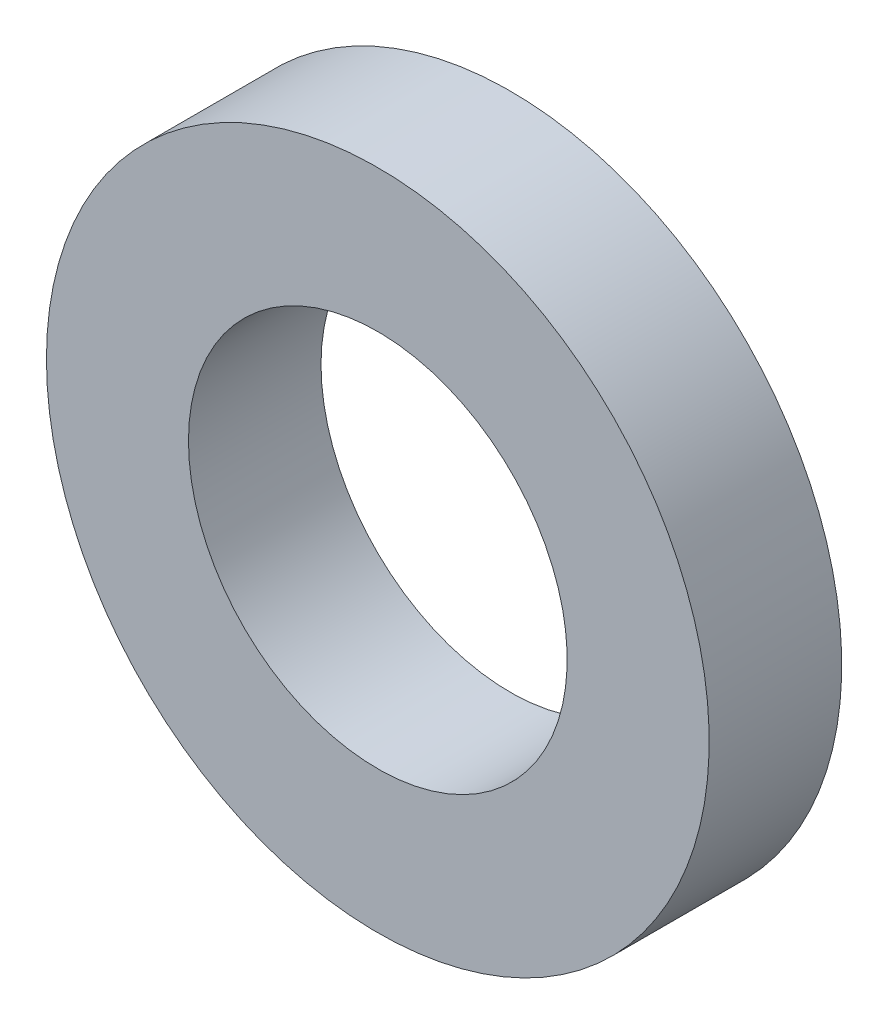
ISO-10303-21;
HEADER;
FILE_DESCRIPTION(('STEP AP214'),'2;1');
FILE_NAME('part.step','',(''),(''),'','','');
FILE_SCHEMA(('AUTOMOTIVE_DESIGN { 1 0 10303 214 1 1 1 1 }'));
ENDSEC;
DATA;
#1=APPLICATION_CONTEXT('core data for automotive mechanical design processes');
#2=APPLICATION_PROTOCOL_DEFINITION('international standard','automotive_design',2000,#1);
#3=PRODUCT_CONTEXT('',#1,'mechanical');
#4=PRODUCT('Part','Part','',(#3));
#5=PRODUCT_RELATED_PRODUCT_CATEGORY('part','',(#4));
#6=PRODUCT_DEFINITION_FORMATION('','',#4);
#7=PRODUCT_DEFINITION_CONTEXT('part definition',#1,'design');
#8=PRODUCT_DEFINITION('design','',#6,#7);
#9=PRODUCT_DEFINITION_SHAPE('','',#8);
#10=(LENGTH_UNIT() NAMED_UNIT(*) SI_UNIT(.MILLI.,.METRE.));
#11=(NAMED_UNIT(*) PLANE_ANGLE_UNIT() SI_UNIT($,.RADIAN.));
#12=(NAMED_UNIT(*) SI_UNIT($,.STERADIAN.) SOLID_ANGLE_UNIT());
#13=UNCERTAINTY_MEASURE_WITH_UNIT(LENGTH_MEASURE(1.E-05),#10,'distance_accuracy_value','');
#14=(GEOMETRIC_REPRESENTATION_CONTEXT(3) GLOBAL_UNCERTAINTY_ASSIGNED_CONTEXT((#13)) GLOBAL_UNIT_ASSIGNED_CONTEXT((#10,
#11,#12)) REPRESENTATION_CONTEXT('',''));
#15=CARTESIAN_POINT('',(0.,0.,0.));
#16=DIRECTION('',(0.,0.,1.));
#17=DIRECTION('',(1.,0.,0.));
#18=AXIS2_PLACEMENT_3D('',#15,#16,#17);
#19=CARTESIAN_POINT('',(0.,0.,14.));
#20=DIRECTION('',(0.,0.,1.));
#21=DIRECTION('',(1.,0.,0.));
#22=AXIS2_PLACEMENT_3D('',#19,#20,#21);
#23=PLANE('',#22);
#24=CARTESIAN_POINT('',(0.,0.,14.));
#25=DIRECTION('',(0.,0.,1.));
#26=DIRECTION('',(1.,0.,0.));
#27=AXIS2_PLACEMENT_3D('',#24,#25,#26);
#28=CIRCLE('',#27,35.);
#29=CARTESIAN_POINT('',(-35.,0.,14.));
#30=VERTEX_POINT('',#29);
#31=EDGE_CURVE('E10',#30,#30,#28,.T.);
#32=ORIENTED_EDGE('',*,*,#31,.T.);
#33=EDGE_LOOP('',(#32));
#34=FACE_BOUND('',#33,.T.);
#35=CARTESIAN_POINT('',(0.,0.,14.));
#36=DIRECTION('',(0.,0.,1.));
#37=DIRECTION('',(1.,0.,0.));
#38=AXIS2_PLACEMENT_3D('',#35,#36,#37);
#39=CIRCLE('',#38,20.);
#40=CARTESIAN_POINT('',(-20.,0.,14.));
#41=VERTEX_POINT('',#40);
#42=EDGE_CURVE('E47',#41,#41,#39,.T.);
#43=ORIENTED_EDGE('',*,*,#42,.F.);
#44=EDGE_LOOP('',(#43));
#45=FACE_BOUND('',#44,.T.);
#46=ADVANCED_FACE('F36',(#34,#45),#23,.T.);
#47=CARTESIAN_POINT('',(0.,0.,0.));
#48=DIRECTION('',(0.,0.,1.));
#49=DIRECTION('',(1.,0.,0.));
#50=AXIS2_PLACEMENT_3D('',#47,#48,#49);
#51=PLANE('',#50);
#52=CARTESIAN_POINT('',(0.,0.,0.));
#53=DIRECTION('',(0.,0.,1.));
#54=DIRECTION('',(1.,0.,0.));
#55=AXIS2_PLACEMENT_3D('',#52,#53,#54);
#56=CIRCLE('',#55,35.);
#57=CARTESIAN_POINT('',(-35.,0.,0.));
#58=VERTEX_POINT('',#57);
#59=EDGE_CURVE('E40',#58,#58,#56,.T.);
#60=ORIENTED_EDGE('',*,*,#59,.F.);
#61=EDGE_LOOP('',(#60));
#62=FACE_BOUND('',#61,.T.);
#63=CARTESIAN_POINT('',(0.,0.,0.));
#64=DIRECTION('',(0.,0.,1.));
#65=DIRECTION('',(1.,0.,0.));
#66=AXIS2_PLACEMENT_3D('',#63,#64,#65);
#67=CIRCLE('',#66,20.);
#68=CARTESIAN_POINT('',(-20.,0.,0.));
#69=VERTEX_POINT('',#68);
#70=EDGE_CURVE('E49',#69,#69,#67,.T.);
#71=ORIENTED_EDGE('',*,*,#70,.T.);
#72=EDGE_LOOP('',(#71));
#73=FACE_BOUND('',#72,.T.);
#74=ADVANCED_FACE('F59',(#62,#73),#51,.F.);
#75=CARTESIAN_POINT('',(0.,0.,14.));
#76=DIRECTION('',(0.,0.,-1.));
#77=DIRECTION('',(-1.,0.,0.));
#78=AXIS2_PLACEMENT_3D('',#75,#76,#77);
#79=CYLINDRICAL_SURFACE('',#78,35.);
#80=CARTESIAN_POINT('',(-35.,0.,14.));
#81=CARTESIAN_POINT('',(-35.,0.,13.8541666666667));
#82=CARTESIAN_POINT('',(-35.,0.,13.7083333333333));
#83=CARTESIAN_POINT('',(-35.,0.,13.4166666666667));
#84=CARTESIAN_POINT('',(-35.,0.,13.2708333333333));
#85=CARTESIAN_POINT('',(-35.,0.,12.9791666666667));
#86=CARTESIAN_POINT('',(-35.,0.,12.8333333333333));
#87=CARTESIAN_POINT('',(-35.,0.,12.5416666666667));
#88=CARTESIAN_POINT('',(-35.,0.,12.3958333333333));
#89=CARTESIAN_POINT('',(-35.,0.,12.1041666666667));
#90=CARTESIAN_POINT('',(-35.,0.,11.9583333333333));
#91=CARTESIAN_POINT('',(-35.,0.,11.6666666666667));
#92=CARTESIAN_POINT('',(-35.,0.,11.5208333333333));
#93=CARTESIAN_POINT('',(-35.,0.,11.2291666666667));
#94=CARTESIAN_POINT('',(-35.,0.,11.0833333333333));
#95=CARTESIAN_POINT('',(-35.,0.,10.7916666666667));
#96=CARTESIAN_POINT('',(-35.,0.,10.6458333333333));
#97=CARTESIAN_POINT('',(-35.,0.,10.3541666666667));
#98=CARTESIAN_POINT('',(-35.,0.,10.2083333333333));
#99=CARTESIAN_POINT('',(-35.,0.,9.91666666666667));
#100=CARTESIAN_POINT('',(-35.,0.,9.77083333333333));
#101=CARTESIAN_POINT('',(-35.,0.,9.47916666666667));
#102=CARTESIAN_POINT('',(-35.,0.,9.33333333333333));
#103=CARTESIAN_POINT('',(-35.,0.,9.04166666666666));
#104=CARTESIAN_POINT('',(-35.,0.,8.89583333333333));
#105=CARTESIAN_POINT('',(-35.,0.,8.60416666666666));
#106=CARTESIAN_POINT('',(-35.,0.,8.45833333333333));
#107=CARTESIAN_POINT('',(-35.,0.,8.16666666666667));
#108=CARTESIAN_POINT('',(-35.,0.,8.02083333333333));
#109=CARTESIAN_POINT('',(-35.,0.,7.72916666666667));
#110=CARTESIAN_POINT('',(-35.,0.,7.58333333333333));
#111=CARTESIAN_POINT('',(-35.,0.,7.29166666666667));
#112=CARTESIAN_POINT('',(-35.,0.,7.14583333333333));
#113=CARTESIAN_POINT('',(-35.,0.,6.85416666666666));
#114=CARTESIAN_POINT('',(-35.,0.,6.70833333333333));
#115=CARTESIAN_POINT('',(-35.,0.,6.41666666666667));
#116=CARTESIAN_POINT('',(-35.,0.,6.27083333333333));
#117=CARTESIAN_POINT('',(-35.,0.,5.97916666666667));
#118=CARTESIAN_POINT('',(-35.,0.,5.83333333333333));
#119=CARTESIAN_POINT('',(-35.,0.,5.54166666666666));
#120=CARTESIAN_POINT('',(-35.,0.,5.39583333333333));
#121=CARTESIAN_POINT('',(-35.,0.,5.10416666666667));
#122=CARTESIAN_POINT('',(-35.,0.,4.95833333333333));
#123=CARTESIAN_POINT('',(-35.,0.,4.66666666666667));
#124=CARTESIAN_POINT('',(-35.,0.,4.52083333333333));
#125=CARTESIAN_POINT('',(-35.,0.,4.22916666666667));
#126=CARTESIAN_POINT('',(-35.,0.,4.08333333333333));
#127=CARTESIAN_POINT('',(-35.,0.,3.79166666666667));
#128=CARTESIAN_POINT('',(-35.,0.,3.64583333333333));
#129=CARTESIAN_POINT('',(-35.,0.,3.35416666666666));
#130=CARTESIAN_POINT('',(-35.,0.,3.20833333333333));
#131=CARTESIAN_POINT('',(-35.,0.,2.91666666666666));
#132=CARTESIAN_POINT('',(-35.,0.,2.77083333333333));
#133=CARTESIAN_POINT('',(-35.,0.,2.47916666666667));
#134=CARTESIAN_POINT('',(-35.,0.,2.33333333333333));
#135=CARTESIAN_POINT('',(-35.,0.,2.04166666666667));
#136=CARTESIAN_POINT('',(-35.,0.,1.89583333333333));
#137=CARTESIAN_POINT('',(-35.,0.,1.60416666666666));
#138=CARTESIAN_POINT('',(-35.,0.,1.45833333333333));
#139=CARTESIAN_POINT('',(-35.,0.,1.16666666666666));
#140=CARTESIAN_POINT('',(-35.,0.,1.02083333333333));
#141=CARTESIAN_POINT('',(-35.,0.,0.729166666666666));
#142=CARTESIAN_POINT('',(-35.,0.,0.583333333333332));
#143=CARTESIAN_POINT('',(-35.,0.,0.291666666666665));
#144=CARTESIAN_POINT('',(-35.,0.,0.145833333333331));
#145=CARTESIAN_POINT('',(-35.,0.,0.));
#146=B_SPLINE_CURVE_WITH_KNOTS('',3,(#80,#81,#82,#83,#84,#85,#86,#87,#88,#89,#90,#91,#92,#93,
#94,#95,#96,#97,#98,#99,#100,#101,#102,#103,#104,#105,#106,#107,#108,#109,#110,#111,#112,#113,
#114,#115,#116,#117,#118,#119,#120,#121,#122,#123,#124,#125,#126,#127,#128,#129,#130,#131,#132,
#133,#134,#135,#136,#137,#138,#139,#140,#141,#142,#143,#144,#145),.UNSPECIFIED.,.F.,.F.,(4,2,2,
2,2,2,2,2,2,2,2,2,2,2,2,2,2,2,2,2,2,2,2,2,2,2,2,2,2,2,2,2,4),(0.,0.437499999999999,
0.874999999999999,1.3125,1.75,2.1875,2.625,3.0625,3.5,3.9375,4.375,4.8125,5.25,5.6875,6.125,
6.5625,7.,7.4375,7.875,8.3125,8.75,9.1875,9.625,10.0625,10.5,10.9375,11.375,11.8125,12.25,
12.6875,13.125,13.5625,14.),.UNSPECIFIED.);
#147=EDGE_CURVE('BSEAM38',#30,#58,#146,.T.);
#148=ORIENTED_EDGE('',*,*,#31,.F.);
#149=ORIENTED_EDGE('',*,*,#59,.T.);
#150=ORIENTED_EDGE('',*,*,#147,.T.);
#151=ORIENTED_EDGE('',*,*,#147,.F.);
#152=EDGE_LOOP('',(#148,#150,#149,#151));
#153=FACE_BOUND('',#152,.T.);
#154=ADVANCED_FACE('F38',(#153),#79,.T.);
#155=CARTESIAN_POINT('',(0.,0.,14.));
#156=DIRECTION('',(0.,0.,-1.));
#157=DIRECTION('',(-1.,0.,0.));
#158=AXIS2_PLACEMENT_3D('',#155,#156,#157);
#159=CYLINDRICAL_SURFACE('',#158,20.);
#160=CARTESIAN_POINT('',(-20.,0.,14.));
#161=CARTESIAN_POINT('',(-20.,0.,13.8541666666667));
#162=CARTESIAN_POINT('',(-20.,0.,13.7083333333333));
#163=CARTESIAN_POINT('',(-20.,0.,13.4166666666667));
#164=CARTESIAN_POINT('',(-20.,0.,13.2708333333333));
#165=CARTESIAN_POINT('',(-20.,0.,12.9791666666667));
#166=CARTESIAN_POINT('',(-20.,0.,12.8333333333333));
#167=CARTESIAN_POINT('',(-20.,0.,12.5416666666667));
#168=CARTESIAN_POINT('',(-20.,0.,12.3958333333333));
#169=CARTESIAN_POINT('',(-20.,0.,12.1041666666667));
#170=CARTESIAN_POINT('',(-20.,0.,11.9583333333333));
#171=CARTESIAN_POINT('',(-20.,0.,11.6666666666667));
#172=CARTESIAN_POINT('',(-20.,0.,11.5208333333333));
#173=CARTESIAN_POINT('',(-20.,0.,11.2291666666667));
#174=CARTESIAN_POINT('',(-20.,0.,11.0833333333333));
#175=CARTESIAN_POINT('',(-20.,0.,10.7916666666667));
#176=CARTESIAN_POINT('',(-20.,0.,10.6458333333333));
#177=CARTESIAN_POINT('',(-20.,0.,10.3541666666667));
#178=CARTESIAN_POINT('',(-20.,0.,10.2083333333333));
#179=CARTESIAN_POINT('',(-20.,0.,9.91666666666667));
#180=CARTESIAN_POINT('',(-20.,0.,9.77083333333333));
#181=CARTESIAN_POINT('',(-20.,0.,9.47916666666667));
#182=CARTESIAN_POINT('',(-20.,0.,9.33333333333333));
#183=CARTESIAN_POINT('',(-20.,0.,9.04166666666666));
#184=CARTESIAN_POINT('',(-20.,0.,8.89583333333333));
#185=CARTESIAN_POINT('',(-20.,0.,8.60416666666666));
#186=CARTESIAN_POINT('',(-20.,0.,8.45833333333333));
#187=CARTESIAN_POINT('',(-20.,0.,8.16666666666666));
#188=CARTESIAN_POINT('',(-20.,0.,8.02083333333333));
#189=CARTESIAN_POINT('',(-20.,0.,7.72916666666666));
#190=CARTESIAN_POINT('',(-20.,0.,7.58333333333333));
#191=CARTESIAN_POINT('',(-20.,0.,7.29166666666666));
#192=CARTESIAN_POINT('',(-20.,0.,7.14583333333333));
#193=CARTESIAN_POINT('',(-20.,0.,6.85416666666666));
#194=CARTESIAN_POINT('',(-20.,0.,6.70833333333333));
#195=CARTESIAN_POINT('',(-20.,0.,6.41666666666666));
#196=CARTESIAN_POINT('',(-20.,0.,6.27083333333333));
#197=CARTESIAN_POINT('',(-20.,0.,5.97916666666667));
#198=CARTESIAN_POINT('',(-20.,0.,5.83333333333333));
#199=CARTESIAN_POINT('',(-20.,0.,5.54166666666667));
#200=CARTESIAN_POINT('',(-20.,0.,5.39583333333333));
#201=CARTESIAN_POINT('',(-20.,0.,5.10416666666667));
#202=CARTESIAN_POINT('',(-20.,0.,4.95833333333333));
#203=CARTESIAN_POINT('',(-20.,0.,4.66666666666667));
#204=CARTESIAN_POINT('',(-20.,0.,4.52083333333333));
#205=CARTESIAN_POINT('',(-20.,0.,4.22916666666667));
#206=CARTESIAN_POINT('',(-20.,0.,4.08333333333333));
#207=CARTESIAN_POINT('',(-20.,0.,3.79166666666667));
#208=CARTESIAN_POINT('',(-20.,0.,3.64583333333333));
#209=CARTESIAN_POINT('',(-20.,0.,3.35416666666667));
#210=CARTESIAN_POINT('',(-20.,0.,3.20833333333333));
#211=CARTESIAN_POINT('',(-20.,0.,2.91666666666667));
#212=CARTESIAN_POINT('',(-20.,0.,2.77083333333333));
#213=CARTESIAN_POINT('',(-20.,0.,2.47916666666667));
#214=CARTESIAN_POINT('',(-20.,0.,2.33333333333333));
#215=CARTESIAN_POINT('',(-20.,0.,2.04166666666667));
#216=CARTESIAN_POINT('',(-20.,0.,1.89583333333333));
#217=CARTESIAN_POINT('',(-20.,0.,1.60416666666666));
#218=CARTESIAN_POINT('',(-20.,0.,1.45833333333333));
#219=CARTESIAN_POINT('',(-20.,0.,1.16666666666666));
#220=CARTESIAN_POINT('',(-20.,0.,1.02083333333333));
#221=CARTESIAN_POINT('',(-20.,0.,0.729166666666666));
#222=CARTESIAN_POINT('',(-20.,0.,0.583333333333332));
#223=CARTESIAN_POINT('',(-20.,0.,0.291666666666665));
#224=CARTESIAN_POINT('',(-20.,0.,0.145833333333331));
#225=CARTESIAN_POINT('',(-20.,0.,0.));
#226=B_SPLINE_CURVE_WITH_KNOTS('',3,(#160,#161,#162,#163,#164,#165,#166,#167,#168,#169,#170,
#171,#172,#173,#174,#175,#176,#177,#178,#179,#180,#181,#182,#183,#184,#185,#186,#187,#188,#189,
#190,#191,#192,#193,#194,#195,#196,#197,#198,#199,#200,#201,#202,#203,#204,#205,#206,#207,#208,
#209,#210,#211,#212,#213,#214,#215,#216,#217,#218,#219,#220,#221,#222,#223,#224,#225),
.UNSPECIFIED.,.F.,.F.,(4,2,2,2,2,2,2,2,2,2,2,2,2,2,2,2,2,2,2,2,2,2,2,2,2,2,2,2,2,2,2,2,4),(0.,
0.4375,0.875000000000001,1.3125,1.75,2.1875,2.625,3.0625,3.5,3.9375,4.375,4.8125,5.25,5.6875,
6.125,6.5625,7.,7.4375,7.875,8.3125,8.75,9.1875,9.625,10.0625,10.5,10.9375,11.375,11.8125,12.25,
12.6875,13.125,13.5625,14.),.UNSPECIFIED.);
#227=EDGE_CURVE('BSEAM55',#41,#69,#226,.T.);
#228=ORIENTED_EDGE('',*,*,#42,.T.);
#229=ORIENTED_EDGE('',*,*,#70,.F.);
#230=ORIENTED_EDGE('',*,*,#227,.T.);
#231=ORIENTED_EDGE('',*,*,#227,.F.);
#232=EDGE_LOOP('',(#228,#230,#229,#231));
#233=FACE_BOUND('',#232,.T.);
#234=ADVANCED_FACE('F55',(#233),#159,.F.);
#235=CLOSED_SHELL('',(#46,#74,#154,#234));
#236=MANIFOLD_SOLID_BREP('B2',#235);
#237=ADVANCED_BREP_SHAPE_REPRESENTATION('',(#18,#236),#14);
#238=SHAPE_DEFINITION_REPRESENTATION(#9,#237);
ENDSEC;
END-ISO-10303-21;
